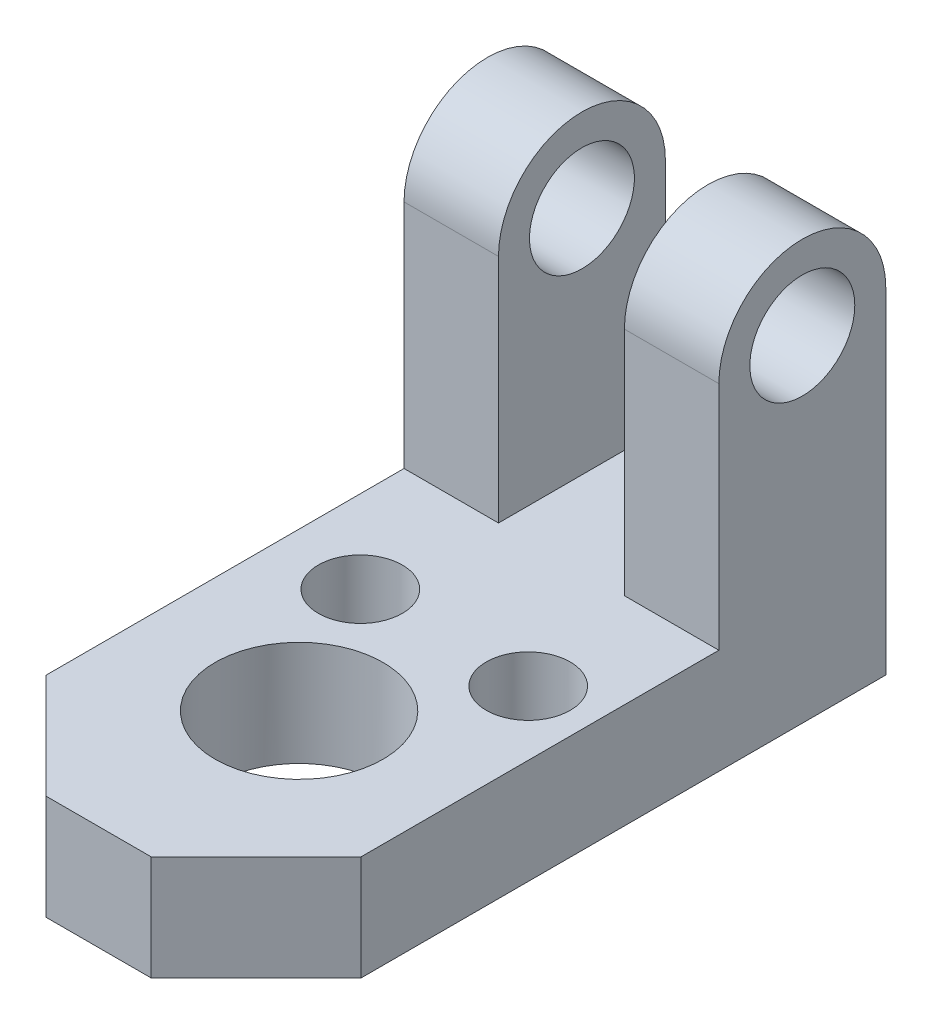
ISO-10303-21;
HEADER;
FILE_DESCRIPTION(('STEP AP214'),'2;1');
FILE_NAME('part.step','',(''),(''),'','','');
FILE_SCHEMA(('AUTOMOTIVE_DESIGN { 1 0 10303 214 1 1 1 1 }'));
ENDSEC;
DATA;
#1=APPLICATION_CONTEXT('core data for automotive mechanical design processes');
#2=APPLICATION_PROTOCOL_DEFINITION('international standard','automotive_design',2000,#1);
#3=PRODUCT_CONTEXT('',#1,'mechanical');
#4=PRODUCT('Part','Part','',(#3));
#5=PRODUCT_RELATED_PRODUCT_CATEGORY('part','',(#4));
#6=PRODUCT_DEFINITION_FORMATION('','',#4);
#7=PRODUCT_DEFINITION_CONTEXT('part definition',#1,'design');
#8=PRODUCT_DEFINITION('design','',#6,#7);
#9=PRODUCT_DEFINITION_SHAPE('','',#8);
#10=(LENGTH_UNIT() NAMED_UNIT(*) SI_UNIT(.MILLI.,.METRE.));
#11=(NAMED_UNIT(*) PLANE_ANGLE_UNIT() SI_UNIT($,.RADIAN.));
#12=(NAMED_UNIT(*) SI_UNIT($,.STERADIAN.) SOLID_ANGLE_UNIT());
#13=UNCERTAINTY_MEASURE_WITH_UNIT(LENGTH_MEASURE(1.E-05),#10,'distance_accuracy_value','');
#14=(GEOMETRIC_REPRESENTATION_CONTEXT(3) GLOBAL_UNCERTAINTY_ASSIGNED_CONTEXT((#13)) GLOBAL_UNIT_ASSIGNED_CONTEXT((#10,
#11,#12)) REPRESENTATION_CONTEXT('',''));
#15=CARTESIAN_POINT('',(0.,0.,0.));
#16=DIRECTION('',(0.,0.,1.));
#17=DIRECTION('',(1.,0.,0.));
#18=AXIS2_PLACEMENT_3D('',#15,#16,#17);
#19=CARTESIAN_POINT('',(0.,10.,0.));
#20=DIRECTION('',(0.,-1.,0.));
#21=DIRECTION('',(0.,0.,-1.));
#22=AXIS2_PLACEMENT_3D('',#19,#20,#21);
#23=PLANE('',#22);
#24=CARTESIAN_POINT('',(-8.83162387874399,10.,-19.3436343504296));
#25=DIRECTION('',(0.,1.,0.));
#26=DIRECTION('',(0.,0.,1.));
#27=AXIS2_PLACEMENT_3D('',#24,#25,#26);
#28=CIRCLE('',#27,4.);
#29=CARTESIAN_POINT('',(-8.83162387874399,10.,-15.3436343504296));
#30=VERTEX_POINT('',#29);
#31=EDGE_CURVE('E519',#30,#30,#28,.T.);
#32=ORIENTED_EDGE('',*,*,#31,.F.);
#33=EDGE_LOOP('',(#32));
#34=FACE_BOUND('',#33,.T.);
#35=CARTESIAN_POINT('',(7.16837612125601,10.,-19.3436343504296));
#36=DIRECTION('',(0.,1.,0.));
#37=DIRECTION('',(0.,0.,1.));
#38=AXIS2_PLACEMENT_3D('',#35,#36,#37);
#39=CIRCLE('',#38,4.);
#40=CARTESIAN_POINT('',(7.16837612125601,10.,-15.3436343504296));
#41=VERTEX_POINT('',#40);
#42=EDGE_CURVE('E527',#41,#41,#39,.T.);
#43=ORIENTED_EDGE('',*,*,#42,.F.);
#44=EDGE_LOOP('',(#43));
#45=FACE_BOUND('',#44,.T.);
#46=CARTESIAN_POINT('',(-1.70984455958552,10.,-6.38802462000326));
#47=DIRECTION('',(0.,1.,0.));
#48=DIRECTION('',(0.,0.,1.));
#49=AXIS2_PLACEMENT_3D('',#46,#47,#48);
#50=CIRCLE('',#49,8.);
#51=CARTESIAN_POINT('',(-1.70984455958552,10.,1.61197537999674));
#52=VERTEX_POINT('',#51);
#53=EDGE_CURVE('E166',#52,#52,#50,.T.);
#54=ORIENTED_EDGE('',*,*,#53,.F.);
#55=EDGE_LOOP('',(#54));
#56=FACE_BOUND('',#55,.T.);
#57=DIRECTION('',(-1.,0.,0.));
#58=VECTOR('',#57,1.);
#59=CARTESIAN_POINT('',(-7.70984455958551,10.,-31.3880246200033));
#60=LINE('',#59,#58);
#61=CARTESIAN_POINT('',(-7.70984455958551,10.,-31.3880246200033));
#62=VERTEX_POINT('',#61);
#63=CARTESIAN_POINT('',(-16.7098445595855,10.,-31.3880246200033));
#64=VERTEX_POINT('',#63);
#65=EDGE_CURVE('E60',#62,#64,#60,.T.);
#66=ORIENTED_EDGE('',*,*,#65,.T.);
#67=DIRECTION('',(0.,0.,1.));
#68=VECTOR('',#67,1.);
#69=CARTESIAN_POINT('',(-16.7098445595855,10.,12.7072538860104));
#70=LINE('',#69,#68);
#71=CARTESIAN_POINT('',(-16.7098445595855,10.,2.70725388601034));
#72=VERTEX_POINT('',#71);
#73=EDGE_CURVE('E192',#64,#72,#70,.T.);
#74=ORIENTED_EDGE('',*,*,#73,.T.);
#75=DIRECTION('',(-0.707106781186547,0.,-0.707106781186549));
#76=VECTOR('',#75,1.);
#77=CARTESIAN_POINT('',(-6.70984455958551,10.,12.7072538860104));
#78=LINE('',#77,#76);
#79=CARTESIAN_POINT('',(-6.7098445595855,10.,12.7072538860104));
#80=VERTEX_POINT('',#79);
#81=EDGE_CURVE('E223',#72,#80,#78,.F.);
#82=ORIENTED_EDGE('',*,*,#81,.T.);
#83=DIRECTION('',(1.,0.,0.));
#84=VECTOR('',#83,1.);
#85=CARTESIAN_POINT('',(13.2901554404145,10.,12.7072538860104));
#86=LINE('',#85,#84);
#87=CARTESIAN_POINT('',(3.29015544041446,10.,12.7072538860104));
#88=VERTEX_POINT('',#87);
#89=EDGE_CURVE('E194',#80,#88,#86,.T.);
#90=ORIENTED_EDGE('',*,*,#89,.T.);
#91=DIRECTION('',(-0.707106781186549,0.,0.707106781186546));
#92=VECTOR('',#91,1.);
#93=CARTESIAN_POINT('',(13.2901554404145,10.,2.70725388601035));
#94=LINE('',#93,#92);
#95=CARTESIAN_POINT('',(13.2901554404145,10.,2.70725388601035));
#96=VERTEX_POINT('',#95);
#97=EDGE_CURVE('E11',#88,#96,#94,.F.);
#98=ORIENTED_EDGE('',*,*,#97,.T.);
#99=DIRECTION('',(0.,0.,-1.));
#100=VECTOR('',#99,1.);
#101=CARTESIAN_POINT('',(13.2901554404145,10.,-47.2927461139896));
#102=LINE('',#101,#100);
#103=CARTESIAN_POINT('',(13.2901554404145,10.,-31.3880246200033));
#104=VERTEX_POINT('',#103);
#105=EDGE_CURVE('E198',#96,#104,#102,.T.);
#106=ORIENTED_EDGE('',*,*,#105,.T.);
#107=DIRECTION('',(1.,0.,0.));
#108=VECTOR('',#107,1.);
#109=CARTESIAN_POINT('',(4.29015544041449,10.,-31.3880246200033));
#110=LINE('',#109,#108);
#111=CARTESIAN_POINT('',(4.29015544041449,10.,-31.3880246200033));
#112=VERTEX_POINT('',#111);
#113=EDGE_CURVE('E184',#112,#104,#110,.T.);
#114=ORIENTED_EDGE('',*,*,#113,.F.);
#115=DIRECTION('',(0.,0.,-1.));
#116=VECTOR('',#115,1.);
#117=CARTESIAN_POINT('',(4.29015544041449,10.,-31.3880246200033));
#118=LINE('',#117,#116);
#119=CARTESIAN_POINT('',(4.29015544041449,10.,-47.2927461139896));
#120=VERTEX_POINT('',#119);
#121=EDGE_CURVE('E172',#112,#120,#118,.T.);
#122=ORIENTED_EDGE('',*,*,#121,.T.);
#123=DIRECTION('',(-1.,0.,0.));
#124=VECTOR('',#123,1.);
#125=CARTESIAN_POINT('',(-16.7098445595855,10.,-47.2927461139896));
#126=LINE('',#125,#124);
#127=CARTESIAN_POINT('',(-7.70984455958551,10.,-47.2927461139896));
#128=VERTEX_POINT('',#127);
#129=EDGE_CURVE('E201',#120,#128,#126,.T.);
#130=ORIENTED_EDGE('',*,*,#129,.T.);
#131=DIRECTION('',(0.,0.,-1.));
#132=VECTOR('',#131,1.);
#133=CARTESIAN_POINT('',(-7.70984455958551,10.,-31.3880246200033));
#134=LINE('',#133,#132);
#135=EDGE_CURVE('E55',#62,#128,#134,.T.);
#136=ORIENTED_EDGE('',*,*,#135,.F.);
#137=EDGE_LOOP('',(#66,#74,#82,#90,#98,#106,#114,#122,#130,#136));
#138=FACE_BOUND('',#137,.T.);
#139=ADVANCED_FACE('F39',(#34,#45,#56,#138),#23,.F.);
#140=CARTESIAN_POINT('',(-16.7098445595855,10.,12.7072538860104));
#141=DIRECTION('',(1.,0.,0.));
#142=DIRECTION('',(0.,0.,-1.));
#143=AXIS2_PLACEMENT_3D('',#140,#141,#142);
#144=PLANE('',#143);
#145=CARTESIAN_POINT('',(-16.7098445595855,32.,-39.3403853669964));
#146=DIRECTION('',(1.,0.,0.));
#147=DIRECTION('',(0.,0.,-1.));
#148=AXIS2_PLACEMENT_3D('',#145,#146,#147);
#149=CIRCLE('',#148,5.);
#150=CARTESIAN_POINT('',(-16.7098445595855,32.,-44.3403853669964));
#151=VERTEX_POINT('',#150);
#152=EDGE_CURVE('E253',#151,#151,#149,.T.);
#153=ORIENTED_EDGE('',*,*,#152,.T.);
#154=EDGE_LOOP('',(#153));
#155=FACE_BOUND('',#154,.T.);
#156=DIRECTION('',(0.,-1.,0.));
#157=VECTOR('',#156,1.);
#158=CARTESIAN_POINT('',(-16.7098445595855,32.,-31.3880246200033));
#159=LINE('',#158,#157);
#160=CARTESIAN_POINT('',(-16.7098445595855,32.,-31.3880246200033));
#161=VERTEX_POINT('',#160);
#162=EDGE_CURVE('E136',#161,#64,#159,.T.);
#163=ORIENTED_EDGE('',*,*,#162,.F.);
#164=CARTESIAN_POINT('',(-16.7098445595855,32.,-39.3403853669964));
#165=DIRECTION('',(1.,0.,0.));
#166=DIRECTION('',(0.,0.,-1.));
#167=AXIS2_PLACEMENT_3D('',#164,#165,#166);
#168=CIRCLE('',#167,7.95236074699319);
#169=CARTESIAN_POINT('',(-16.7098445595855,32.,-47.2927461139896));
#170=VERTEX_POINT('',#169);
#171=EDGE_CURVE('E137',#170,#161,#168,.T.);
#172=ORIENTED_EDGE('',*,*,#171,.F.);
#173=DIRECTION('',(0.,-1.,0.));
#174=VECTOR('',#173,1.);
#175=CARTESIAN_POINT('',(-16.7098445595855,10.,-47.2927461139896));
#176=LINE('',#175,#174);
#177=CARTESIAN_POINT('',(-16.7098445595855,0.,-47.2927461139896));
#178=VERTEX_POINT('',#177);
#179=EDGE_CURVE('E149',#170,#178,#176,.T.);
#180=ORIENTED_EDGE('',*,*,#179,.T.);
#181=DIRECTION('',(0.,0.,1.));
#182=VECTOR('',#181,1.);
#183=CARTESIAN_POINT('',(-16.7098445595855,0.,12.7072538860104));
#184=LINE('',#183,#182);
#185=CARTESIAN_POINT('',(-16.7098445595855,0.,2.70725388601034));
#186=VERTEX_POINT('',#185);
#187=EDGE_CURVE('E186',#178,#186,#184,.T.);
#188=ORIENTED_EDGE('',*,*,#187,.T.);
#189=DIRECTION('',(0.,1.,0.));
#190=VECTOR('',#189,1.);
#191=CARTESIAN_POINT('',(-16.7098445595855,10.,2.70725388601034));
#192=LINE('',#191,#190);
#193=EDGE_CURVE('E220',#186,#72,#192,.T.);
#194=ORIENTED_EDGE('',*,*,#193,.T.);
#195=ORIENTED_EDGE('',*,*,#73,.F.);
#196=EDGE_LOOP('',(#163,#172,#180,#188,#194,#195));
#197=FACE_BOUND('',#196,.T.);
#198=ADVANCED_FACE('F250',(#155,#197),#144,.F.);
#199=CARTESIAN_POINT('',(13.2901554404145,10.,12.7072538860104));
#200=DIRECTION('',(0.,0.,-1.));
#201=DIRECTION('',(-1.,0.,0.));
#202=AXIS2_PLACEMENT_3D('',#199,#200,#201);
#203=PLANE('',#202);
#204=DIRECTION('',(1.,0.,0.));
#205=VECTOR('',#204,1.);
#206=CARTESIAN_POINT('',(13.2901554404145,0.,12.7072538860104));
#207=LINE('',#206,#205);
#208=CARTESIAN_POINT('',(-6.7098445595855,0.,12.7072538860104));
#209=VERTEX_POINT('',#208);
#210=CARTESIAN_POINT('',(3.29015544041446,0.,12.7072538860104));
#211=VERTEX_POINT('',#210);
#212=EDGE_CURVE('E205',#209,#211,#207,.T.);
#213=ORIENTED_EDGE('',*,*,#212,.T.);
#214=DIRECTION('',(0.,1.,0.));
#215=VECTOR('',#214,1.);
#216=CARTESIAN_POINT('',(3.29015544041445,10.,12.7072538860104));
#217=LINE('',#216,#215);
#218=EDGE_CURVE('E48',#211,#88,#217,.T.);
#219=ORIENTED_EDGE('',*,*,#218,.T.);
#220=ORIENTED_EDGE('',*,*,#89,.F.);
#221=DIRECTION('',(0.,-1.,0.));
#222=VECTOR('',#221,1.);
#223=CARTESIAN_POINT('',(-6.70984455958551,10.,12.7072538860104));
#224=LINE('',#223,#222);
#225=EDGE_CURVE('E215',#80,#209,#224,.T.);
#226=ORIENTED_EDGE('',*,*,#225,.T.);
#227=EDGE_LOOP('',(#213,#219,#220,#226));
#228=FACE_BOUND('',#227,.T.);
#229=ADVANCED_FACE('F232',(#228),#203,.F.);
#230=CARTESIAN_POINT('',(13.2901554404145,10.,-47.2927461139896));
#231=DIRECTION('',(-1.,0.,0.));
#232=DIRECTION('',(0.,0.,1.));
#233=AXIS2_PLACEMENT_3D('',#230,#231,#232);
#234=PLANE('',#233);
#235=CARTESIAN_POINT('',(13.2901554404145,32.,-39.3403853669964));
#236=DIRECTION('',(1.,0.,0.));
#237=DIRECTION('',(0.,0.,-1.));
#238=AXIS2_PLACEMENT_3D('',#235,#236,#237);
#239=CIRCLE('',#238,5.);
#240=CARTESIAN_POINT('',(13.2901554404145,32.,-44.3403853669964));
#241=VERTEX_POINT('',#240);
#242=EDGE_CURVE('E150',#241,#241,#239,.T.);
#243=ORIENTED_EDGE('',*,*,#242,.F.);
#244=EDGE_LOOP('',(#243));
#245=FACE_BOUND('',#244,.T.);
#246=DIRECTION('',(0.,-1.,0.));
#247=VECTOR('',#246,1.);
#248=CARTESIAN_POINT('',(13.2901554404145,10.,-47.2927461139896));
#249=LINE('',#248,#247);
#250=CARTESIAN_POINT('',(13.2901554404145,32.,-47.2927461139896));
#251=VERTEX_POINT('',#250);
#252=CARTESIAN_POINT('',(13.2901554404145,0.,-47.2927461139896));
#253=VERTEX_POINT('',#252);
#254=EDGE_CURVE('E212',#251,#253,#249,.T.);
#255=ORIENTED_EDGE('',*,*,#254,.F.);
#256=CARTESIAN_POINT('',(13.2901554404145,32.,-39.3403853669964));
#257=DIRECTION('',(1.,0.,0.));
#258=DIRECTION('',(0.,0.,-1.));
#259=AXIS2_PLACEMENT_3D('',#256,#257,#258);
#260=CIRCLE('',#259,7.95236074699319);
#261=CARTESIAN_POINT('',(13.2901554404145,32.,-31.3880246200033));
#262=VERTEX_POINT('',#261);
#263=EDGE_CURVE('E161',#251,#262,#260,.T.);
#264=ORIENTED_EDGE('',*,*,#263,.T.);
#265=DIRECTION('',(0.,-1.,0.));
#266=VECTOR('',#265,1.);
#267=CARTESIAN_POINT('',(13.2901554404145,32.,-31.3880246200033));
#268=LINE('',#267,#266);
#269=EDGE_CURVE('E169',#262,#104,#268,.T.);
#270=ORIENTED_EDGE('',*,*,#269,.T.);
#271=ORIENTED_EDGE('',*,*,#105,.F.);
#272=DIRECTION('',(0.,-1.,0.));
#273=VECTOR('',#272,1.);
#274=CARTESIAN_POINT('',(13.2901554404145,10.,2.70725388601035));
#275=LINE('',#274,#273);
#276=CARTESIAN_POINT('',(13.2901554404145,0.,2.70725388601035));
#277=VERTEX_POINT('',#276);
#278=EDGE_CURVE('E225',#96,#277,#275,.T.);
#279=ORIENTED_EDGE('',*,*,#278,.T.);
#280=DIRECTION('',(0.,0.,-1.));
#281=VECTOR('',#280,1.);
#282=CARTESIAN_POINT('',(13.2901554404145,0.,-47.2927461139896));
#283=LINE('',#282,#281);
#284=EDGE_CURVE('E208',#277,#253,#283,.T.);
#285=ORIENTED_EDGE('',*,*,#284,.T.);
#286=EDGE_LOOP('',(#255,#264,#270,#271,#279,#285));
#287=FACE_BOUND('',#286,.T.);
#288=ADVANCED_FACE('F243',(#245,#287),#234,.F.);
#289=CARTESIAN_POINT('',(-16.7098445595855,10.,-47.2927461139896));
#290=DIRECTION('',(0.,0.,1.));
#291=DIRECTION('',(1.,0.,0.));
#292=AXIS2_PLACEMENT_3D('',#289,#290,#291);
#293=PLANE('',#292);
#294=DIRECTION('',(-1.,0.,0.));
#295=VECTOR('',#294,1.);
#296=CARTESIAN_POINT('',(-16.7098445595855,0.,-47.2927461139896));
#297=LINE('',#296,#295);
#298=EDGE_CURVE('E195',#253,#178,#297,.T.);
#299=ORIENTED_EDGE('',*,*,#298,.T.);
#300=ORIENTED_EDGE('',*,*,#179,.F.);
#301=DIRECTION('',(-1.,0.,0.));
#302=VECTOR('',#301,1.);
#303=CARTESIAN_POINT('',(-7.70984455958551,32.,-47.2927461139896));
#304=LINE('',#303,#302);
#305=CARTESIAN_POINT('',(-7.70984455958551,32.,-47.2927461139896));
#306=VERTEX_POINT('',#305);
#307=EDGE_CURVE('E130',#306,#170,#304,.T.);
#308=ORIENTED_EDGE('',*,*,#307,.F.);
#309=DIRECTION('',(0.,1.,0.));
#310=VECTOR('',#309,1.);
#311=CARTESIAN_POINT('',(-7.70984455958551,10.,-47.2927461139896));
#312=LINE('',#311,#310);
#313=EDGE_CURVE('E140',#128,#306,#312,.T.);
#314=ORIENTED_EDGE('',*,*,#313,.F.);
#315=ORIENTED_EDGE('',*,*,#129,.F.);
#316=DIRECTION('',(0.,1.,0.));
#317=VECTOR('',#316,1.);
#318=CARTESIAN_POINT('',(4.29015544041449,10.,-47.2927461139896));
#319=LINE('',#318,#317);
#320=CARTESIAN_POINT('',(4.29015544041449,32.,-47.2927461139896));
#321=VERTEX_POINT('',#320);
#322=EDGE_CURVE('E175',#120,#321,#319,.T.);
#323=ORIENTED_EDGE('',*,*,#322,.T.);
#324=DIRECTION('',(1.,0.,0.));
#325=VECTOR('',#324,1.);
#326=CARTESIAN_POINT('',(4.29015544041449,32.,-47.2927461139896));
#327=LINE('',#326,#325);
#328=EDGE_CURVE('E181',#321,#251,#327,.T.);
#329=ORIENTED_EDGE('',*,*,#328,.T.);
#330=ORIENTED_EDGE('',*,*,#254,.T.);
#331=EDGE_LOOP('',(#299,#300,#308,#314,#315,#323,#329,#330));
#332=FACE_BOUND('',#331,.T.);
#333=ADVANCED_FACE('F147',(#332),#293,.F.);
#334=CARTESIAN_POINT('',(0.,0.,0.));
#335=DIRECTION('',(0.,-1.,0.));
#336=DIRECTION('',(0.,0.,-1.));
#337=AXIS2_PLACEMENT_3D('',#334,#335,#336);
#338=PLANE('',#337);
#339=CARTESIAN_POINT('',(-8.83162387874399,0.,-19.3436343504296));
#340=DIRECTION('',(0.,-1.,0.));
#341=DIRECTION('',(0.,0.,-1.));
#342=AXIS2_PLACEMENT_3D('',#339,#340,#341);
#343=CIRCLE('',#342,4.);
#344=CARTESIAN_POINT('',(-8.83162387874399,0.,-23.3436343504296));
#345=VERTEX_POINT('',#344);
#346=EDGE_CURVE('E517',#345,#345,#343,.F.);
#347=ORIENTED_EDGE('',*,*,#346,.T.);
#348=EDGE_LOOP('',(#347));
#349=FACE_BOUND('',#348,.T.);
#350=CARTESIAN_POINT('',(7.16837612125601,0.,-19.3436343504296));
#351=DIRECTION('',(0.,-1.,0.));
#352=DIRECTION('',(0.,0.,-1.));
#353=AXIS2_PLACEMENT_3D('',#350,#351,#352);
#354=CIRCLE('',#353,4.);
#355=CARTESIAN_POINT('',(7.16837612125601,0.,-23.3436343504296));
#356=VERTEX_POINT('',#355);
#357=EDGE_CURVE('E522',#356,#356,#354,.F.);
#358=ORIENTED_EDGE('',*,*,#357,.T.);
#359=EDGE_LOOP('',(#358));
#360=FACE_BOUND('',#359,.T.);
#361=CARTESIAN_POINT('',(-1.70984455958552,0.,-6.38802462000326));
#362=DIRECTION('',(0.,-1.,0.));
#363=DIRECTION('',(0.,0.,-1.));
#364=AXIS2_PLACEMENT_3D('',#361,#362,#363);
#365=CIRCLE('',#364,8.);
#366=CARTESIAN_POINT('',(-1.70984455958552,0.,-14.3880246200033));
#367=VERTEX_POINT('',#366);
#368=EDGE_CURVE('E164',#367,#367,#365,.F.);
#369=ORIENTED_EDGE('',*,*,#368,.T.);
#370=EDGE_LOOP('',(#369));
#371=FACE_BOUND('',#370,.T.);
#372=ORIENTED_EDGE('',*,*,#284,.F.);
#373=DIRECTION('',(0.707106781186549,0.,-0.707106781186546));
#374=VECTOR('',#373,1.);
#375=CARTESIAN_POINT('',(7.9987046632124,0.,7.99870466321243));
#376=LINE('',#375,#374);
#377=EDGE_CURVE('E228',#277,#211,#376,.F.);
#378=ORIENTED_EDGE('',*,*,#377,.T.);
#379=ORIENTED_EDGE('',*,*,#212,.F.);
#380=DIRECTION('',(0.707106781186547,0.,0.707106781186549));
#381=VECTOR('',#380,1.);
#382=CARTESIAN_POINT('',(-9.70854922279795,0.,9.70854922279792));
#383=LINE('',#382,#381);
#384=EDGE_CURVE('E218',#209,#186,#383,.F.);
#385=ORIENTED_EDGE('',*,*,#384,.T.);
#386=ORIENTED_EDGE('',*,*,#187,.F.);
#387=ORIENTED_EDGE('',*,*,#298,.F.);
#388=EDGE_LOOP('',(#372,#378,#379,#385,#386,#387));
#389=FACE_BOUND('',#388,.T.);
#390=ADVANCED_FACE('F246',(#349,#360,#371,#389),#338,.T.);
#391=CARTESIAN_POINT('',(-6.70984455958551,10.,12.7072538860104));
#392=DIRECTION('',(0.707106781186549,0.,-0.707106781186547));
#393=DIRECTION('',(0.,-1.,0.));
#394=AXIS2_PLACEMENT_3D('',#391,#392,#393);
#395=PLANE('',#394);
#396=ORIENTED_EDGE('',*,*,#81,.F.);
#397=ORIENTED_EDGE('',*,*,#193,.F.);
#398=ORIENTED_EDGE('',*,*,#384,.F.);
#399=ORIENTED_EDGE('',*,*,#225,.F.);
#400=EDGE_LOOP('',(#396,#397,#398,#399));
#401=FACE_BOUND('',#400,.T.);
#402=ADVANCED_FACE('F291',(#401),#395,.F.);
#403=CARTESIAN_POINT('',(13.2901554404145,10.,2.70725388601035));
#404=DIRECTION('',(-0.707106781186546,0.,-0.707106781186549));
#405=DIRECTION('',(0.,-1.,0.));
#406=AXIS2_PLACEMENT_3D('',#403,#404,#405);
#407=PLANE('',#406);
#408=ORIENTED_EDGE('',*,*,#97,.F.);
#409=ORIENTED_EDGE('',*,*,#218,.F.);
#410=ORIENTED_EDGE('',*,*,#377,.F.);
#411=ORIENTED_EDGE('',*,*,#278,.F.);
#412=EDGE_LOOP('',(#408,#409,#410,#411));
#413=FACE_BOUND('',#412,.T.);
#414=ADVANCED_FACE('F42',(#413),#407,.F.);
#415=CARTESIAN_POINT('',(4.29015544041449,32.,-31.3880246200033));
#416=DIRECTION('',(0.,0.,1.));
#417=DIRECTION('',(0.,-1.,0.));
#418=AXIS2_PLACEMENT_3D('',#415,#416,#417);
#419=PLANE('',#418);
#420=ORIENTED_EDGE('',*,*,#269,.F.);
#421=DIRECTION('',(1.,0.,0.));
#422=VECTOR('',#421,1.);
#423=CARTESIAN_POINT('',(4.29015544041449,32.,-31.3880246200033));
#424=LINE('',#423,#422);
#425=CARTESIAN_POINT('',(4.29015544041449,32.,-31.3880246200033));
#426=VERTEX_POINT('',#425);
#427=EDGE_CURVE('E187',#426,#262,#424,.T.);
#428=ORIENTED_EDGE('',*,*,#427,.F.);
#429=DIRECTION('',(0.,-1.,0.));
#430=VECTOR('',#429,1.);
#431=CARTESIAN_POINT('',(4.29015544041449,32.,-31.3880246200033));
#432=LINE('',#431,#430);
#433=EDGE_CURVE('E178',#426,#112,#432,.T.);
#434=ORIENTED_EDGE('',*,*,#433,.T.);
#435=ORIENTED_EDGE('',*,*,#113,.T.);
#436=EDGE_LOOP('',(#420,#428,#434,#435));
#437=FACE_BOUND('',#436,.T.);
#438=ADVANCED_FACE('F287',(#437),#419,.T.);
#439=CARTESIAN_POINT('',(4.2901554404145,0.,0.));
#440=DIRECTION('',(1.,0.,0.));
#441=DIRECTION('',(0.,0.,-1.));
#442=AXIS2_PLACEMENT_3D('',#439,#440,#441);
#443=PLANE('',#442);
#444=CARTESIAN_POINT('',(4.29015544041449,32.,-39.3403853669964));
#445=DIRECTION('',(1.,0.,0.));
#446=DIRECTION('',(0.,0.,-1.));
#447=AXIS2_PLACEMENT_3D('',#444,#445,#446);
#448=CIRCLE('',#447,5.);
#449=CARTESIAN_POINT('',(4.29015544041449,32.,-44.3403853669964));
#450=VERTEX_POINT('',#449);
#451=EDGE_CURVE('E153',#450,#450,#448,.F.);
#452=ORIENTED_EDGE('',*,*,#451,.F.);
#453=EDGE_LOOP('',(#452));
#454=FACE_BOUND('',#453,.T.);
#455=ORIENTED_EDGE('',*,*,#433,.F.);
#456=CARTESIAN_POINT('',(4.29015544041449,32.,-39.3403853669964));
#457=DIRECTION('',(1.,0.,0.));
#458=DIRECTION('',(0.,0.,-1.));
#459=AXIS2_PLACEMENT_3D('',#456,#457,#458);
#460=CIRCLE('',#459,7.95236074699319);
#461=EDGE_CURVE('E162',#321,#426,#460,.T.);
#462=ORIENTED_EDGE('',*,*,#461,.F.);
#463=ORIENTED_EDGE('',*,*,#322,.F.);
#464=ORIENTED_EDGE('',*,*,#121,.F.);
#465=EDGE_LOOP('',(#455,#462,#463,#464));
#466=FACE_BOUND('',#465,.T.);
#467=ADVANCED_FACE('F310',(#454,#466),#443,.F.);
#468=CARTESIAN_POINT('',(-1.70984455958552,-0.000999999999999265,-6.38802462000326));
#469=DIRECTION('',(0.,1.,0.));
#470=DIRECTION('',(0.,0.,1.));
#471=AXIS2_PLACEMENT_3D('',#468,#469,#470);
#472=CYLINDRICAL_SURFACE('',#471,8.);
#473=ORIENTED_EDGE('',*,*,#368,.F.);
#474=EDGE_LOOP('',(#473));
#475=FACE_BOUND('',#474,.T.);
#476=ORIENTED_EDGE('',*,*,#53,.T.);
#477=EDGE_LOOP('',(#476));
#478=FACE_BOUND('',#477,.T.);
#479=ADVANCED_FACE('F315',(#475,#478),#472,.F.);
#480=CARTESIAN_POINT('',(4.29015544041449,32.,-39.3403853669964));
#481=DIRECTION('',(1.,0.,0.));
#482=DIRECTION('',(0.,0.,-1.));
#483=AXIS2_PLACEMENT_3D('',#480,#481,#482);
#484=CYLINDRICAL_SURFACE('',#483,7.95236074699319);
#485=ORIENTED_EDGE('',*,*,#461,.T.);
#486=ORIENTED_EDGE('',*,*,#427,.T.);
#487=ORIENTED_EDGE('',*,*,#263,.F.);
#488=ORIENTED_EDGE('',*,*,#328,.F.);
#489=EDGE_LOOP('',(#485,#486,#487,#488));
#490=FACE_BOUND('',#489,.T.);
#491=ADVANCED_FACE('F272',(#490),#484,.T.);
#492=CARTESIAN_POINT('',(-16.7108445595855,32.,-39.3403853669964));
#493=DIRECTION('',(1.,0.,0.));
#494=DIRECTION('',(0.,0.,-1.));
#495=AXIS2_PLACEMENT_3D('',#492,#493,#494);
#496=CYLINDRICAL_SURFACE('',#495,5.);
#497=ORIENTED_EDGE('',*,*,#242,.T.);
#498=EDGE_LOOP('',(#497));
#499=FACE_BOUND('',#498,.T.);
#500=ORIENTED_EDGE('',*,*,#451,.T.);
#501=EDGE_LOOP('',(#500));
#502=FACE_BOUND('',#501,.T.);
#503=ADVANCED_FACE('F264',(#499,#502),#496,.F.);
#504=CARTESIAN_POINT('',(-7.70984455958551,32.,-31.3880246200033));
#505=DIRECTION('',(0.,0.,-1.));
#506=DIRECTION('',(0.,1.,0.));
#507=AXIS2_PLACEMENT_3D('',#504,#505,#506);
#508=PLANE('',#507);
#509=ORIENTED_EDGE('',*,*,#162,.T.);
#510=ORIENTED_EDGE('',*,*,#65,.F.);
#511=DIRECTION('',(0.,-1.,0.));
#512=VECTOR('',#511,1.);
#513=CARTESIAN_POINT('',(-7.70984455958551,32.,-31.3880246200033));
#514=LINE('',#513,#512);
#515=CARTESIAN_POINT('',(-7.7098445595855,32.,-31.3880246200033));
#516=VERTEX_POINT('',#515);
#517=EDGE_CURVE('E144',#516,#62,#514,.T.);
#518=ORIENTED_EDGE('',*,*,#517,.F.);
#519=DIRECTION('',(-1.,0.,0.));
#520=VECTOR('',#519,1.);
#521=CARTESIAN_POINT('',(-7.70984455958551,32.,-31.3880246200033));
#522=LINE('',#521,#520);
#523=EDGE_CURVE('E133',#516,#161,#522,.T.);
#524=ORIENTED_EDGE('',*,*,#523,.T.);
#525=EDGE_LOOP('',(#509,#510,#518,#524));
#526=FACE_BOUND('',#525,.T.);
#527=ADVANCED_FACE('F262',(#526),#508,.F.);
#528=CARTESIAN_POINT('',(-7.70984455958551,0.,0.));
#529=DIRECTION('',(-1.,0.,0.));
#530=DIRECTION('',(0.,0.,-1.));
#531=AXIS2_PLACEMENT_3D('',#528,#529,#530);
#532=PLANE('',#531);
#533=CARTESIAN_POINT('',(-7.70984455958551,32.,-39.3403853669964));
#534=DIRECTION('',(-1.,0.,0.));
#535=DIRECTION('',(0.,0.,1.));
#536=AXIS2_PLACEMENT_3D('',#533,#534,#535);
#537=CIRCLE('',#536,5.);
#538=CARTESIAN_POINT('',(-7.70984455958551,32.,-34.3403853669965));
#539=VERTEX_POINT('',#538);
#540=EDGE_CURVE('E256',#539,#539,#537,.T.);
#541=ORIENTED_EDGE('',*,*,#540,.T.);
#542=EDGE_LOOP('',(#541));
#543=FACE_BOUND('',#542,.T.);
#544=ORIENTED_EDGE('',*,*,#313,.T.);
#545=CARTESIAN_POINT('',(-7.70984455958551,32.,-39.3403853669964));
#546=DIRECTION('',(1.,0.,0.));
#547=DIRECTION('',(0.,0.,-1.));
#548=AXIS2_PLACEMENT_3D('',#545,#546,#547);
#549=CIRCLE('',#548,7.95236074699319);
#550=EDGE_CURVE('E126',#306,#516,#549,.T.);
#551=ORIENTED_EDGE('',*,*,#550,.T.);
#552=ORIENTED_EDGE('',*,*,#517,.T.);
#553=ORIENTED_EDGE('',*,*,#135,.T.);
#554=EDGE_LOOP('',(#544,#551,#552,#553));
#555=FACE_BOUND('',#554,.T.);
#556=ADVANCED_FACE('F141',(#543,#555),#532,.F.);
#557=CARTESIAN_POINT('',(-7.70984455958551,32.,-39.3403853669964));
#558=DIRECTION('',(-1.,0.,0.));
#559=DIRECTION('',(0.,0.,1.));
#560=AXIS2_PLACEMENT_3D('',#557,#558,#559);
#561=CYLINDRICAL_SURFACE('',#560,7.95236074699319);
#562=ORIENTED_EDGE('',*,*,#550,.F.);
#563=ORIENTED_EDGE('',*,*,#307,.T.);
#564=ORIENTED_EDGE('',*,*,#171,.T.);
#565=ORIENTED_EDGE('',*,*,#523,.F.);
#566=EDGE_LOOP('',(#562,#563,#564,#565));
#567=FACE_BOUND('',#566,.T.);
#568=ADVANCED_FACE('F128',(#567),#561,.T.);
#569=CARTESIAN_POINT('',(13.2911554404145,32.,-39.3403853669964));
#570=DIRECTION('',(-1.,0.,0.));
#571=DIRECTION('',(0.,0.,1.));
#572=AXIS2_PLACEMENT_3D('',#569,#570,#571);
#573=CYLINDRICAL_SURFACE('',#572,5.);
#574=ORIENTED_EDGE('',*,*,#152,.F.);
#575=EDGE_LOOP('',(#574));
#576=FACE_BOUND('',#575,.T.);
#577=ORIENTED_EDGE('',*,*,#540,.F.);
#578=EDGE_LOOP('',(#577));
#579=FACE_BOUND('',#578,.T.);
#580=ADVANCED_FACE('F390',(#576,#579),#573,.F.);
#581=CARTESIAN_POINT('',(7.16837612125601,-0.000999999999999265,-19.3436343504296));
#582=DIRECTION('',(0.,1.,0.));
#583=DIRECTION('',(0.,0.,1.));
#584=AXIS2_PLACEMENT_3D('',#581,#582,#583);
#585=CYLINDRICAL_SURFACE('',#584,4.);
#586=ORIENTED_EDGE('',*,*,#357,.F.);
#587=EDGE_LOOP('',(#586));
#588=FACE_BOUND('',#587,.T.);
#589=ORIENTED_EDGE('',*,*,#42,.T.);
#590=EDGE_LOOP('',(#589));
#591=FACE_BOUND('',#590,.T.);
#592=ADVANCED_FACE('F399',(#588,#591),#585,.F.);
#593=CARTESIAN_POINT('',(-8.83162387874399,-0.000999999999999265,-19.3436343504296));
#594=DIRECTION('',(0.,1.,0.));
#595=DIRECTION('',(0.,0.,1.));
#596=AXIS2_PLACEMENT_3D('',#593,#594,#595);
#597=CYLINDRICAL_SURFACE('',#596,4.);
#598=ORIENTED_EDGE('',*,*,#346,.F.);
#599=EDGE_LOOP('',(#598));
#600=FACE_BOUND('',#599,.T.);
#601=ORIENTED_EDGE('',*,*,#31,.T.);
#602=EDGE_LOOP('',(#601));
#603=FACE_BOUND('',#602,.T.);
#604=ADVANCED_FACE('F424',(#600,#603),#597,.F.);
#605=CLOSED_SHELL('',(#139,#198,#229,#288,#333,#390,#402,#414,#438,#467,#479,#491,#503,#527,
#556,#568,#580,#592,#604));
#606=MANIFOLD_SOLID_BREP('B2',#605);
#607=ADVANCED_BREP_SHAPE_REPRESENTATION('',(#18,#606),#14);
#608=SHAPE_DEFINITION_REPRESENTATION(#9,#607);
ENDSEC;
END-ISO-10303-21;
